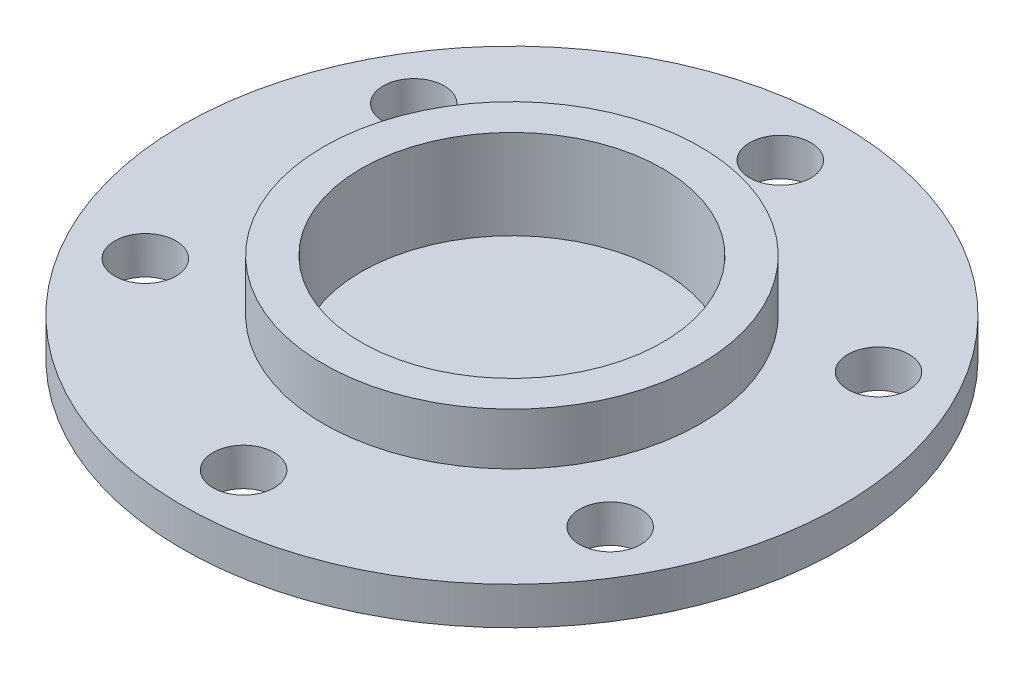
ISO-10303-21;
HEADER;
FILE_DESCRIPTION(('STEP AP214'),'2;1');
FILE_NAME('part.step','',(''),(''),'','','');
FILE_SCHEMA(('AUTOMOTIVE_DESIGN { 1 0 10303 214 1 1 1 1 }'));
ENDSEC;
DATA;
#1=APPLICATION_CONTEXT('core data for automotive mechanical design processes');
#2=APPLICATION_PROTOCOL_DEFINITION('international standard','automotive_design',2000,#1);
#3=PRODUCT_CONTEXT('',#1,'mechanical');
#4=PRODUCT('Part','Part','',(#3));
#5=PRODUCT_RELATED_PRODUCT_CATEGORY('part','',(#4));
#6=PRODUCT_DEFINITION_FORMATION('','',#4);
#7=PRODUCT_DEFINITION_CONTEXT('part definition',#1,'design');
#8=PRODUCT_DEFINITION('design','',#6,#7);
#9=PRODUCT_DEFINITION_SHAPE('','',#8);
#10=(LENGTH_UNIT() NAMED_UNIT(*) SI_UNIT(.MILLI.,.METRE.));
#11=(NAMED_UNIT(*) PLANE_ANGLE_UNIT() SI_UNIT($,.RADIAN.));
#12=(NAMED_UNIT(*) SI_UNIT($,.STERADIAN.) SOLID_ANGLE_UNIT());
#13=UNCERTAINTY_MEASURE_WITH_UNIT(LENGTH_MEASURE(1.E-05),#10,'distance_accuracy_value','');
#14=(GEOMETRIC_REPRESENTATION_CONTEXT(3) GLOBAL_UNCERTAINTY_ASSIGNED_CONTEXT((#13)) GLOBAL_UNIT_ASSIGNED_CONTEXT((#10,
#11,#12)) REPRESENTATION_CONTEXT('',''));
#15=CARTESIAN_POINT('',(0.,0.,0.));
#16=DIRECTION('',(0.,0.,1.));
#17=DIRECTION('',(1.,0.,0.));
#18=AXIS2_PLACEMENT_3D('',#15,#16,#17);
#19=CARTESIAN_POINT('',(-35.,0.,0.));
#20=DIRECTION('',(0.,1.,0.));
#21=DIRECTION('',(-1.,0.,0.));
#22=AXIS2_PLACEMENT_3D('',#19,#20,#21);
#23=PLANE('',#22);
#24=CARTESIAN_POINT('',(-24.6817240078557,0.,14.2499999999986));
#25=DIRECTION('',(0.,1.,0.));
#26=DIRECTION('',(-1.,0.,0.));
#27=AXIS2_PLACEMENT_3D('',#24,#25,#26);
#28=CIRCLE('',#27,3.25000000000152);
#29=CARTESIAN_POINT('',(-27.9317240078572,0.,14.2499999999986));
#30=VERTEX_POINT('',#29);
#31=EDGE_CURVE('E96',#30,#30,#28,.T.);
#32=ORIENTED_EDGE('',*,*,#31,.F.);
#33=EDGE_LOOP('',(#32));
#34=FACE_BOUND('',#33,.T.);
#35=CARTESIAN_POINT('',(-24.6817240078541,0.,-14.2500000000014));
#36=DIRECTION('',(0.,1.,0.));
#37=DIRECTION('',(-1.,0.,0.));
#38=AXIS2_PLACEMENT_3D('',#35,#36,#37);
#39=CIRCLE('',#38,3.25000000000299);
#40=CARTESIAN_POINT('',(-27.9317240078571,0.,-14.2500000000014));
#41=VERTEX_POINT('',#40);
#42=EDGE_CURVE('E90',#41,#41,#39,.T.);
#43=ORIENTED_EDGE('',*,*,#42,.F.);
#44=EDGE_LOOP('',(#43));
#45=FACE_BOUND('',#44,.T.);
#46=CARTESIAN_POINT('',(3.23309438831092E-12,0.,-28.5));
#47=DIRECTION('',(0.,1.,0.));
#48=DIRECTION('',(-1.,0.,0.));
#49=AXIS2_PLACEMENT_3D('',#46,#47,#48);
#50=CIRCLE('',#49,3.25000000000328);
#51=CARTESIAN_POINT('',(-3.25000000000005,0.,-28.5));
#52=VERTEX_POINT('',#51);
#53=EDGE_CURVE('E84',#52,#52,#50,.T.);
#54=ORIENTED_EDGE('',*,*,#53,.F.);
#55=EDGE_LOOP('',(#54));
#56=FACE_BOUND('',#55,.T.);
#57=CARTESIAN_POINT('',(24.6817240078589,0.,-14.2499999999986));
#58=DIRECTION('',(0.,1.,0.));
#59=DIRECTION('',(-1.,0.,0.));
#60=AXIS2_PLACEMENT_3D('',#57,#58,#59);
#61=CIRCLE('',#60,3.25000000000204);
#62=CARTESIAN_POINT('',(21.4317240078569,0.,-14.2499999999986));
#63=VERTEX_POINT('',#62);
#64=EDGE_CURVE('E78',#63,#63,#61,.T.);
#65=ORIENTED_EDGE('',*,*,#64,.F.);
#66=EDGE_LOOP('',(#65));
#67=FACE_BOUND('',#66,.T.);
#68=CARTESIAN_POINT('',(24.6817240078573,0.,14.2500000000014));
#69=DIRECTION('',(0.,1.,0.));
#70=DIRECTION('',(-1.,0.,0.));
#71=AXIS2_PLACEMENT_3D('',#68,#69,#70);
#72=CIRCLE('',#71,3.25000000000043);
#73=CARTESIAN_POINT('',(21.4317240078569,0.,14.2500000000014));
#74=VERTEX_POINT('',#73);
#75=EDGE_CURVE('E72',#74,#74,#72,.T.);
#76=ORIENTED_EDGE('',*,*,#75,.F.);
#77=EDGE_LOOP('',(#76));
#78=FACE_BOUND('',#77,.T.);
#79=CARTESIAN_POINT('',(0.,0.,28.5));
#80=DIRECTION('',(0.,1.,0.));
#81=DIRECTION('',(-1.,0.,0.));
#82=AXIS2_PLACEMENT_3D('',#79,#80,#81);
#83=CIRCLE('',#82,3.25);
#84=CARTESIAN_POINT('',(-3.25,0.,28.5));
#85=VERTEX_POINT('',#84);
#86=EDGE_CURVE('E66',#85,#85,#83,.T.);
#87=ORIENTED_EDGE('',*,*,#86,.F.);
#88=EDGE_LOOP('',(#87));
#89=FACE_BOUND('',#88,.T.);
#90=CARTESIAN_POINT('',(0.,0.,0.));
#91=DIRECTION('',(0.,1.,0.));
#92=DIRECTION('',(-1.,0.,0.));
#93=AXIS2_PLACEMENT_3D('',#90,#91,#92);
#94=CIRCLE('',#93,35.);
#95=CARTESIAN_POINT('',(-35.,0.,0.));
#96=VERTEX_POINT('',#95);
#97=EDGE_CURVE('E11',#96,#96,#94,.T.);
#98=ORIENTED_EDGE('',*,*,#97,.T.);
#99=EDGE_LOOP('',(#98));
#100=FACE_BOUND('',#99,.T.);
#101=CARTESIAN_POINT('',(0.,0.,0.));
#102=DIRECTION('',(0.,1.,0.));
#103=DIRECTION('',(-1.,0.,0.));
#104=AXIS2_PLACEMENT_3D('',#101,#102,#103);
#105=CIRCLE('',#104,20.);
#106=CARTESIAN_POINT('',(-20.,0.,0.));
#107=VERTEX_POINT('',#106);
#108=EDGE_CURVE('E63',#107,#107,#105,.T.);
#109=ORIENTED_EDGE('',*,*,#108,.F.);
#110=EDGE_LOOP('',(#109));
#111=FACE_BOUND('',#110,.T.);
#112=ADVANCED_FACE('F32',(#34,#45,#56,#67,#78,#89,#100,#111),#23,.T.);
#113=CARTESIAN_POINT('',(0.,0.,0.));
#114=DIRECTION('',(0.,1.,0.));
#115=DIRECTION('',(-1.,0.,0.));
#116=AXIS2_PLACEMENT_3D('',#113,#114,#115);
#117=CYLINDRICAL_SURFACE('',#116,35.);
#118=CARTESIAN_POINT('',(0.,-3.99999999999999,0.));
#119=DIRECTION('',(0.,1.,0.));
#120=DIRECTION('',(-1.,0.,0.));
#121=AXIS2_PLACEMENT_3D('',#118,#119,#120);
#122=CIRCLE('',#121,35.);
#123=CARTESIAN_POINT('',(-35.,-4.,0.));
#124=VERTEX_POINT('',#123);
#125=EDGE_CURVE('E38',#124,#124,#122,.T.);
#126=ORIENTED_EDGE('',*,*,#125,.T.);
#127=EDGE_LOOP('',(#126));
#128=FACE_BOUND('',#127,.T.);
#129=ORIENTED_EDGE('',*,*,#97,.F.);
#130=EDGE_LOOP('',(#129));
#131=FACE_BOUND('',#130,.T.);
#132=ADVANCED_FACE('F107',(#128,#131),#117,.T.);
#133=CARTESIAN_POINT('',(-20.063981042654,-4.,0.));
#134=DIRECTION('',(0.,-1.,0.));
#135=DIRECTION('',(1.,0.,0.));
#136=AXIS2_PLACEMENT_3D('',#133,#134,#135);
#137=PLANE('',#136);
#138=CARTESIAN_POINT('',(-24.6817240078557,-4.,14.2499999999986));
#139=DIRECTION('',(0.,-1.,0.));
#140=DIRECTION('',(1.,0.,0.));
#141=AXIS2_PLACEMENT_3D('',#138,#139,#140);
#142=CIRCLE('',#141,3.25000000000152);
#143=CARTESIAN_POINT('',(-21.4317240078542,-4.,14.2499999999986));
#144=VERTEX_POINT('',#143);
#145=EDGE_CURVE('E99',#144,#144,#142,.T.);
#146=ORIENTED_EDGE('',*,*,#145,.F.);
#147=EDGE_LOOP('',(#146));
#148=FACE_BOUND('',#147,.T.);
#149=CARTESIAN_POINT('',(-24.6817240078541,-4.,-14.2500000000014));
#150=DIRECTION('',(0.,-1.,0.));
#151=DIRECTION('',(1.,0.,0.));
#152=AXIS2_PLACEMENT_3D('',#149,#150,#151);
#153=CIRCLE('',#152,3.25000000000299);
#154=CARTESIAN_POINT('',(-21.4317240078511,-4.,-14.2500000000014));
#155=VERTEX_POINT('',#154);
#156=EDGE_CURVE('E93',#155,#155,#153,.T.);
#157=ORIENTED_EDGE('',*,*,#156,.F.);
#158=EDGE_LOOP('',(#157));
#159=FACE_BOUND('',#158,.T.);
#160=CARTESIAN_POINT('',(3.23377557891348E-12,-3.99999999999999,-28.5));
#161=DIRECTION('',(0.,-1.,0.));
#162=DIRECTION('',(1.,0.,0.));
#163=AXIS2_PLACEMENT_3D('',#160,#161,#162);
#164=CIRCLE('',#163,3.25000000000328);
#165=CARTESIAN_POINT('',(3.25000000000652,-3.99999999999999,-28.5));
#166=VERTEX_POINT('',#165);
#167=EDGE_CURVE('E87',#166,#166,#164,.T.);
#168=ORIENTED_EDGE('',*,*,#167,.F.);
#169=EDGE_LOOP('',(#168));
#170=FACE_BOUND('',#169,.T.);
#171=CARTESIAN_POINT('',(24.6817240078589,-3.99999999999999,-14.2499999999986));
#172=DIRECTION('',(0.,-1.,0.));
#173=DIRECTION('',(1.,0.,0.));
#174=AXIS2_PLACEMENT_3D('',#171,#172,#173);
#175=CIRCLE('',#174,3.25000000000204);
#176=CARTESIAN_POINT('',(27.931724007861,-3.99999999999999,-14.2499999999986));
#177=VERTEX_POINT('',#176);
#178=EDGE_CURVE('E81',#177,#177,#175,.T.);
#179=ORIENTED_EDGE('',*,*,#178,.F.);
#180=EDGE_LOOP('',(#179));
#181=FACE_BOUND('',#180,.T.);
#182=CARTESIAN_POINT('',(24.6817240078573,-3.99999999999999,14.2500000000014));
#183=DIRECTION('',(0.,-1.,0.));
#184=DIRECTION('',(1.,0.,0.));
#185=AXIS2_PLACEMENT_3D('',#182,#183,#184);
#186=CIRCLE('',#185,3.25000000000043);
#187=CARTESIAN_POINT('',(27.9317240078577,-3.99999999999999,14.2500000000014));
#188=VERTEX_POINT('',#187);
#189=EDGE_CURVE('E75',#188,#188,#186,.T.);
#190=ORIENTED_EDGE('',*,*,#189,.F.);
#191=EDGE_LOOP('',(#190));
#192=FACE_BOUND('',#191,.T.);
#193=CARTESIAN_POINT('',(0.,-3.99999999999999,28.5));
#194=DIRECTION('',(0.,-1.,0.));
#195=DIRECTION('',(1.,0.,0.));
#196=AXIS2_PLACEMENT_3D('',#193,#194,#195);
#197=CIRCLE('',#196,3.25);
#198=CARTESIAN_POINT('',(3.25,-3.99999999999999,28.5));
#199=VERTEX_POINT('',#198);
#200=EDGE_CURVE('E69',#199,#199,#197,.T.);
#201=ORIENTED_EDGE('',*,*,#200,.F.);
#202=EDGE_LOOP('',(#201));
#203=FACE_BOUND('',#202,.T.);
#204=CARTESIAN_POINT('',(0.,-3.99999999999999,0.));
#205=DIRECTION('',(0.,1.,0.));
#206=DIRECTION('',(-1.,0.,0.));
#207=AXIS2_PLACEMENT_3D('',#204,#205,#206);
#208=CIRCLE('',#207,20.063981042654);
#209=CARTESIAN_POINT('',(-20.063981042654,-4.,0.));
#210=VERTEX_POINT('',#209);
#211=EDGE_CURVE('E49',#210,#210,#208,.T.);
#212=ORIENTED_EDGE('',*,*,#211,.T.);
#213=EDGE_LOOP('',(#212));
#214=FACE_BOUND('',#213,.T.);
#215=ORIENTED_EDGE('',*,*,#125,.F.);
#216=EDGE_LOOP('',(#215));
#217=FACE_BOUND('',#216,.T.);
#218=ADVANCED_FACE('F45',(#148,#159,#170,#181,#192,#203,#214,#217),#137,.T.);
#219=CARTESIAN_POINT('',(0.,-3.99999999999999,0.));
#220=DIRECTION('',(0.,1.,0.));
#221=DIRECTION('',(-1.,0.,0.));
#222=AXIS2_PLACEMENT_3D('',#219,#220,#221);
#223=CONICAL_SURFACE('',#222,20.063981042654,1.08866264225615);
#224=CARTESIAN_POINT('',(0.,-14.5,0.));
#225=VERTEX_POINT('',#224);
#226=VERTEX_LOOP('',#225);
#227=FACE_BOUND('',#226,.T.);
#228=ORIENTED_EDGE('',*,*,#211,.F.);
#229=EDGE_LOOP('',(#228));
#230=FACE_BOUND('',#229,.T.);
#231=ADVANCED_FACE('F41',(#227,#230),#223,.T.);
#232=CARTESIAN_POINT('',(-16.,-4.,0.));
#233=DIRECTION('',(0.,1.,0.));
#234=DIRECTION('',(-1.,0.,0.));
#235=AXIS2_PLACEMENT_3D('',#232,#233,#234);
#236=PLANE('',#235);
#237=CARTESIAN_POINT('',(0.,-4.,0.));
#238=DIRECTION('',(0.,1.,0.));
#239=DIRECTION('',(-1.,0.,0.));
#240=AXIS2_PLACEMENT_3D('',#237,#238,#239);
#241=CIRCLE('',#240,16.);
#242=CARTESIAN_POINT('',(-16.,-4.,0.));
#243=VERTEX_POINT('',#242);
#244=EDGE_CURVE('E51',#243,#243,#241,.T.);
#245=ORIENTED_EDGE('',*,*,#244,.T.);
#246=EDGE_LOOP('',(#245));
#247=FACE_BOUND('',#246,.T.);
#248=ADVANCED_FACE('F44',(#247),#236,.T.);
#249=CARTESIAN_POINT('',(0.,0.,0.));
#250=DIRECTION('',(0.,1.,0.));
#251=DIRECTION('',(-1.,0.,0.));
#252=AXIS2_PLACEMENT_3D('',#249,#250,#251);
#253=CYLINDRICAL_SURFACE('',#252,16.);
#254=CARTESIAN_POINT('',(0.,5.5,0.));
#255=DIRECTION('',(0.,1.,0.));
#256=DIRECTION('',(-1.,0.,0.));
#257=AXIS2_PLACEMENT_3D('',#254,#255,#256);
#258=CIRCLE('',#257,16.);
#259=CARTESIAN_POINT('',(-16.,5.5,0.));
#260=VERTEX_POINT('',#259);
#261=EDGE_CURVE('E55',#260,#260,#258,.T.);
#262=ORIENTED_EDGE('',*,*,#261,.T.);
#263=EDGE_LOOP('',(#262));
#264=FACE_BOUND('',#263,.T.);
#265=ORIENTED_EDGE('',*,*,#244,.F.);
#266=EDGE_LOOP('',(#265));
#267=FACE_BOUND('',#266,.T.);
#268=ADVANCED_FACE('F140',(#264,#267),#253,.F.);
#269=CARTESIAN_POINT('',(-20.,5.5,0.));
#270=DIRECTION('',(0.,1.,0.));
#271=DIRECTION('',(-1.,0.,0.));
#272=AXIS2_PLACEMENT_3D('',#269,#270,#271);
#273=PLANE('',#272);
#274=CARTESIAN_POINT('',(0.,5.5,0.));
#275=DIRECTION('',(0.,1.,0.));
#276=DIRECTION('',(-1.,0.,0.));
#277=AXIS2_PLACEMENT_3D('',#274,#275,#276);
#278=CIRCLE('',#277,20.);
#279=CARTESIAN_POINT('',(-20.,5.5,0.));
#280=VERTEX_POINT('',#279);
#281=EDGE_CURVE('E60',#280,#280,#278,.T.);
#282=ORIENTED_EDGE('',*,*,#281,.T.);
#283=EDGE_LOOP('',(#282));
#284=FACE_BOUND('',#283,.T.);
#285=ORIENTED_EDGE('',*,*,#261,.F.);
#286=EDGE_LOOP('',(#285));
#287=FACE_BOUND('',#286,.T.);
#288=ADVANCED_FACE('F134',(#284,#287),#273,.T.);
#289=CARTESIAN_POINT('',(0.,0.,0.));
#290=DIRECTION('',(0.,1.,0.));
#291=DIRECTION('',(-1.,0.,0.));
#292=AXIS2_PLACEMENT_3D('',#289,#290,#291);
#293=CYLINDRICAL_SURFACE('',#292,20.);
#294=ORIENTED_EDGE('',*,*,#108,.T.);
#295=EDGE_LOOP('',(#294));
#296=FACE_BOUND('',#295,.T.);
#297=ORIENTED_EDGE('',*,*,#281,.F.);
#298=EDGE_LOOP('',(#297));
#299=FACE_BOUND('',#298,.T.);
#300=ADVANCED_FACE('F130',(#296,#299),#293,.T.);
#301=CARTESIAN_POINT('',(0.,6.00000000000001,28.5));
#302=DIRECTION('',(0.,-1.,0.));
#303=DIRECTION('',(1.,0.,0.));
#304=AXIS2_PLACEMENT_3D('',#301,#302,#303);
#305=CYLINDRICAL_SURFACE('',#304,3.25);
#306=ORIENTED_EDGE('',*,*,#86,.T.);
#307=EDGE_LOOP('',(#306));
#308=FACE_BOUND('',#307,.T.);
#309=ORIENTED_EDGE('',*,*,#200,.T.);
#310=EDGE_LOOP('',(#309));
#311=FACE_BOUND('',#310,.T.);
#312=ADVANCED_FACE('F133',(#308,#311),#305,.F.);
#313=CARTESIAN_POINT('',(24.6817240078573,6.00000000000001,14.2500000000014));
#314=DIRECTION('',(0.,-1.,0.));
#315=DIRECTION('',(1.,0.,0.));
#316=AXIS2_PLACEMENT_3D('',#313,#314,#315);
#317=CYLINDRICAL_SURFACE('',#316,3.25000000000043);
#318=ORIENTED_EDGE('',*,*,#75,.T.);
#319=EDGE_LOOP('',(#318));
#320=FACE_BOUND('',#319,.T.);
#321=ORIENTED_EDGE('',*,*,#189,.T.);
#322=EDGE_LOOP('',(#321));
#323=FACE_BOUND('',#322,.T.);
#324=ADVANCED_FACE('F156',(#320,#323),#317,.F.);
#325=CARTESIAN_POINT('',(24.6817240078589,6.00000000000001,-14.2499999999986));
#326=DIRECTION('',(0.,-1.,0.));
#327=DIRECTION('',(1.,0.,0.));
#328=AXIS2_PLACEMENT_3D('',#325,#326,#327);
#329=CYLINDRICAL_SURFACE('',#328,3.25000000000204);
#330=ORIENTED_EDGE('',*,*,#64,.T.);
#331=EDGE_LOOP('',(#330));
#332=FACE_BOUND('',#331,.T.);
#333=ORIENTED_EDGE('',*,*,#178,.T.);
#334=EDGE_LOOP('',(#333));
#335=FACE_BOUND('',#334,.T.);
#336=ADVANCED_FACE('F160',(#332,#335),#329,.F.);
#337=CARTESIAN_POINT('',(3.23207260240707E-12,6.00000000000001,-28.5));
#338=DIRECTION('',(0.,-1.,0.));
#339=DIRECTION('',(1.,0.,0.));
#340=AXIS2_PLACEMENT_3D('',#337,#338,#339);
#341=CYLINDRICAL_SURFACE('',#340,3.25000000000328);
#342=ORIENTED_EDGE('',*,*,#53,.T.);
#343=EDGE_LOOP('',(#342));
#344=FACE_BOUND('',#343,.T.);
#345=ORIENTED_EDGE('',*,*,#167,.T.);
#346=EDGE_LOOP('',(#345));
#347=FACE_BOUND('',#346,.T.);
#348=ADVANCED_FACE('F164',(#344,#347),#341,.F.);
#349=CARTESIAN_POINT('',(-24.6817240078541,6.,-14.2500000000014));
#350=DIRECTION('',(0.,-1.,0.));
#351=DIRECTION('',(1.,0.,0.));
#352=AXIS2_PLACEMENT_3D('',#349,#350,#351);
#353=CYLINDRICAL_SURFACE('',#352,3.25000000000299);
#354=ORIENTED_EDGE('',*,*,#42,.T.);
#355=EDGE_LOOP('',(#354));
#356=FACE_BOUND('',#355,.T.);
#357=ORIENTED_EDGE('',*,*,#156,.T.);
#358=EDGE_LOOP('',(#357));
#359=FACE_BOUND('',#358,.T.);
#360=ADVANCED_FACE('F168',(#356,#359),#353,.F.);
#361=CARTESIAN_POINT('',(-24.6817240078557,6.,14.2499999999986));
#362=DIRECTION('',(0.,-1.,0.));
#363=DIRECTION('',(1.,0.,0.));
#364=AXIS2_PLACEMENT_3D('',#361,#362,#363);
#365=CYLINDRICAL_SURFACE('',#364,3.25000000000152);
#366=ORIENTED_EDGE('',*,*,#31,.T.);
#367=EDGE_LOOP('',(#366));
#368=FACE_BOUND('',#367,.T.);
#369=ORIENTED_EDGE('',*,*,#145,.T.);
#370=EDGE_LOOP('',(#369));
#371=FACE_BOUND('',#370,.T.);
#372=ADVANCED_FACE('F103',(#368,#371),#365,.F.);
#373=CLOSED_SHELL('',(#112,#132,#218,#231,#248,#268,#288,#300,#312,#324,#336,#348,#360,#372));
#374=MANIFOLD_SOLID_BREP('B2',#373);
#375=ADVANCED_BREP_SHAPE_REPRESENTATION('',(#18,#374),#14);
#376=SHAPE_DEFINITION_REPRESENTATION(#9,#375);
ENDSEC;
END-ISO-10303-21;
